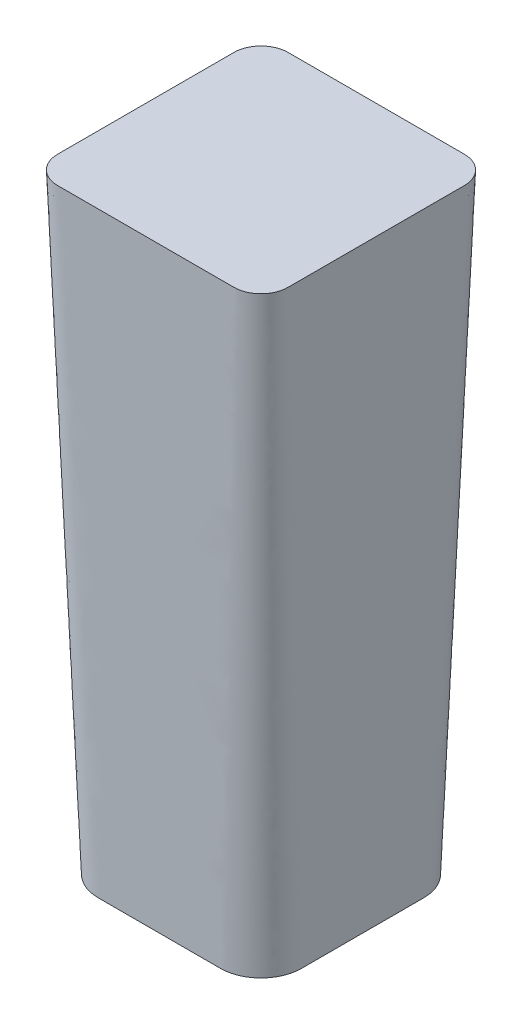
ISO-10303-21;
HEADER;
FILE_DESCRIPTION(('STEP AP214'),'2;1');
FILE_NAME('part.step','',(''),(''),'','','');
FILE_SCHEMA(('AUTOMOTIVE_DESIGN { 1 0 10303 214 1 1 1 1 }'));
ENDSEC;
DATA;
#1=APPLICATION_CONTEXT('core data for automotive mechanical design processes');
#2=APPLICATION_PROTOCOL_DEFINITION('international standard','automotive_design',2000,#1);
#3=PRODUCT_CONTEXT('',#1,'mechanical');
#4=PRODUCT('Part','Part','',(#3));
#5=PRODUCT_RELATED_PRODUCT_CATEGORY('part','',(#4));
#6=PRODUCT_DEFINITION_FORMATION('','',#4);
#7=PRODUCT_DEFINITION_CONTEXT('part definition',#1,'design');
#8=PRODUCT_DEFINITION('design','',#6,#7);
#9=PRODUCT_DEFINITION_SHAPE('','',#8);
#10=(LENGTH_UNIT() NAMED_UNIT(*) SI_UNIT(.MILLI.,.METRE.));
#11=(NAMED_UNIT(*) PLANE_ANGLE_UNIT() SI_UNIT($,.RADIAN.));
#12=(NAMED_UNIT(*) SI_UNIT($,.STERADIAN.) SOLID_ANGLE_UNIT());
#13=UNCERTAINTY_MEASURE_WITH_UNIT(LENGTH_MEASURE(1.E-05),#10,'distance_accuracy_value','');
#14=(GEOMETRIC_REPRESENTATION_CONTEXT(3) GLOBAL_UNCERTAINTY_ASSIGNED_CONTEXT((#13)) GLOBAL_UNIT_ASSIGNED_CONTEXT((#10,
#11,#12)) REPRESENTATION_CONTEXT('',''));
#15=CARTESIAN_POINT('',(0.,0.,0.));
#16=DIRECTION('',(0.,0.,1.));
#17=DIRECTION('',(1.,0.,0.));
#18=AXIS2_PLACEMENT_3D('',#15,#16,#17);
#19=CARTESIAN_POINT('',(-4.5,0.,-4.5));
#20=DIRECTION('',(0.,1.,0.));
#21=DIRECTION('',(0.,0.,1.));
#22=AXIS2_PLACEMENT_3D('',#19,#20,#21);
#23=PLANE('',#22);
#24=CARTESIAN_POINT('',(-4.5,0.,-4.5));
#25=DIRECTION('',(0.,1.,0.));
#26=DIRECTION('',(0.,0.,1.));
#27=AXIS2_PLACEMENT_3D('',#24,#25,#26);
#28=CIRCLE('',#27,3.);
#29=CARTESIAN_POINT('',(-4.49999999999998,0.,-7.5));
#30=VERTEX_POINT('',#29);
#31=CARTESIAN_POINT('',(-7.5,0.,-4.49999999999998));
#32=VERTEX_POINT('',#31);
#33=EDGE_CURVE('E306',#30,#32,#28,.T.);
#34=ORIENTED_EDGE('',*,*,#33,.F.);
#35=DIRECTION('',(1.,0.,0.));
#36=VECTOR('',#35,1.);
#37=CARTESIAN_POINT('',(-4.49999999999998,0.,-7.5));
#38=LINE('',#37,#36);
#39=CARTESIAN_POINT('',(4.49999999999998,0.,-7.5));
#40=VERTEX_POINT('',#39);
#41=EDGE_CURVE('E12',#30,#40,#38,.T.);
#42=ORIENTED_EDGE('',*,*,#41,.T.);
#43=CARTESIAN_POINT('',(4.5,0.,-4.5));
#44=DIRECTION('',(0.,1.,0.));
#45=DIRECTION('',(0.,0.,1.));
#46=AXIS2_PLACEMENT_3D('',#43,#44,#45);
#47=CIRCLE('',#46,3.);
#48=CARTESIAN_POINT('',(7.5,0.,-4.49999999999998));
#49=VERTEX_POINT('',#48);
#50=EDGE_CURVE('E242',#49,#40,#47,.T.);
#51=ORIENTED_EDGE('',*,*,#50,.F.);
#52=DIRECTION('',(0.,0.,1.));
#53=VECTOR('',#52,1.);
#54=CARTESIAN_POINT('',(7.5,0.,-4.49999999999998));
#55=LINE('',#54,#53);
#56=CARTESIAN_POINT('',(7.5,0.,4.49999999999998));
#57=VERTEX_POINT('',#56);
#58=EDGE_CURVE('E438',#49,#57,#55,.T.);
#59=ORIENTED_EDGE('',*,*,#58,.T.);
#60=CARTESIAN_POINT('',(4.5,0.,4.5));
#61=DIRECTION('',(0.,-1.,0.));
#62=DIRECTION('',(0.,0.,-1.));
#63=AXIS2_PLACEMENT_3D('',#60,#61,#62);
#64=CIRCLE('',#63,3.);
#65=CARTESIAN_POINT('',(4.49999999999998,0.,7.5));
#66=VERTEX_POINT('',#65);
#67=EDGE_CURVE('E448',#57,#66,#64,.T.);
#68=ORIENTED_EDGE('',*,*,#67,.T.);
#69=DIRECTION('',(1.,0.,0.));
#70=VECTOR('',#69,1.);
#71=CARTESIAN_POINT('',(-4.49999999999998,0.,7.5));
#72=LINE('',#71,#70);
#73=CARTESIAN_POINT('',(-4.49999999999998,0.,7.5));
#74=VERTEX_POINT('',#73);
#75=EDGE_CURVE('E462',#74,#66,#72,.T.);
#76=ORIENTED_EDGE('',*,*,#75,.F.);
#77=CARTESIAN_POINT('',(-4.5,0.,4.5));
#78=DIRECTION('',(0.,-1.,0.));
#79=DIRECTION('',(0.,0.,-1.));
#80=AXIS2_PLACEMENT_3D('',#77,#78,#79);
#81=CIRCLE('',#80,3.);
#82=CARTESIAN_POINT('',(-7.5,0.,4.49999999999998));
#83=VERTEX_POINT('',#82);
#84=EDGE_CURVE('E472',#74,#83,#81,.T.);
#85=ORIENTED_EDGE('',*,*,#84,.T.);
#86=DIRECTION('',(0.,0.,1.));
#87=VECTOR('',#86,1.);
#88=CARTESIAN_POINT('',(-7.5,0.,-4.49999999999998));
#89=LINE('',#88,#87);
#90=EDGE_CURVE('E485',#32,#83,#89,.T.);
#91=ORIENTED_EDGE('',*,*,#90,.F.);
#92=EDGE_LOOP('',(#34,#42,#51,#59,#68,#76,#85,#91));
#93=FACE_BOUND('',#92,.T.);
#94=ADVANCED_FACE('F232',(#93),#23,.F.);
#95=CARTESIAN_POINT('',(-6.5,45.,-6.5));
#96=DIRECTION('',(0.,1.,0.));
#97=DIRECTION('',(0.,0.,1.));
#98=AXIS2_PLACEMENT_3D('',#95,#96,#97);
#99=PLANE('',#98);
#100=CARTESIAN_POINT('',(-6.5,45.,-6.5));
#101=DIRECTION('',(0.,1.,0.));
#102=DIRECTION('',(0.,0.,1.));
#103=AXIS2_PLACEMENT_3D('',#100,#101,#102);
#104=CIRCLE('',#103,2.);
#105=CARTESIAN_POINT('',(-6.49999999999999,45.,-8.5));
#106=VERTEX_POINT('',#105);
#107=CARTESIAN_POINT('',(-8.5,45.,-6.49999999989903));
#108=VERTEX_POINT('',#107);
#109=EDGE_CURVE('E304',#106,#108,#104,.T.);
#110=ORIENTED_EDGE('',*,*,#109,.T.);
#111=DIRECTION('',(0.,0.,1.));
#112=VECTOR('',#111,1.);
#113=CARTESIAN_POINT('',(-8.5,45.,-6.49999999999999));
#114=LINE('',#113,#112);
#115=CARTESIAN_POINT('',(-8.50000000000001,45.,6.49999999999061));
#116=VERTEX_POINT('',#115);
#117=EDGE_CURVE('E373',#108,#116,#114,.T.);
#118=ORIENTED_EDGE('',*,*,#117,.T.);
#119=CARTESIAN_POINT('',(-6.5,45.,6.5));
#120=DIRECTION('',(0.,-1.,0.));
#121=DIRECTION('',(0.,0.,-1.));
#122=AXIS2_PLACEMENT_3D('',#119,#120,#121);
#123=CIRCLE('',#122,2.);
#124=CARTESIAN_POINT('',(-6.49999999989855,45.,8.5));
#125=VERTEX_POINT('',#124);
#126=EDGE_CURVE('E379',#125,#116,#123,.T.);
#127=ORIENTED_EDGE('',*,*,#126,.F.);
#128=DIRECTION('',(1.,0.,0.));
#129=VECTOR('',#128,1.);
#130=CARTESIAN_POINT('',(-6.49999999999999,45.,8.5));
#131=LINE('',#130,#129);
#132=CARTESIAN_POINT('',(6.49999999999062,45.,8.50000000000001));
#133=VERTEX_POINT('',#132);
#134=EDGE_CURVE('E382',#125,#133,#131,.T.);
#135=ORIENTED_EDGE('',*,*,#134,.T.);
#136=CARTESIAN_POINT('',(6.5,45.,6.5));
#137=DIRECTION('',(0.,1.,0.));
#138=DIRECTION('',(0.,0.,1.));
#139=AXIS2_PLACEMENT_3D('',#136,#137,#138);
#140=CIRCLE('',#139,2.);
#141=CARTESIAN_POINT('',(8.5,45.,6.49999999989878));
#142=VERTEX_POINT('',#141);
#143=EDGE_CURVE('E629',#133,#142,#140,.T.);
#144=ORIENTED_EDGE('',*,*,#143,.T.);
#145=DIRECTION('',(0.,0.,1.));
#146=VECTOR('',#145,1.);
#147=CARTESIAN_POINT('',(8.5,45.,-6.49999999999999));
#148=LINE('',#147,#146);
#149=CARTESIAN_POINT('',(8.5,45.,-6.49999999999061));
#150=VERTEX_POINT('',#149);
#151=EDGE_CURVE('E314',#150,#142,#148,.T.);
#152=ORIENTED_EDGE('',*,*,#151,.F.);
#153=CARTESIAN_POINT('',(6.5,45.,-6.5));
#154=DIRECTION('',(0.,1.,0.));
#155=DIRECTION('',(0.,0.,1.));
#156=AXIS2_PLACEMENT_3D('',#153,#154,#155);
#157=CIRCLE('',#156,2.);
#158=CARTESIAN_POINT('',(6.49999999999999,45.,-8.5));
#159=VERTEX_POINT('',#158);
#160=EDGE_CURVE('E298',#150,#159,#157,.T.);
#161=ORIENTED_EDGE('',*,*,#160,.T.);
#162=DIRECTION('',(1.,0.,0.));
#163=VECTOR('',#162,1.);
#164=CARTESIAN_POINT('',(-6.49999999999999,45.,-8.5));
#165=LINE('',#164,#163);
#166=EDGE_CURVE('E297',#106,#159,#165,.T.);
#167=ORIENTED_EDGE('',*,*,#166,.F.);
#168=EDGE_LOOP('',(#110,#118,#127,#135,#144,#152,#161,#167));
#169=FACE_BOUND('',#168,.T.);
#170=ADVANCED_FACE('F315',(#169),#99,.T.);
#171=CARTESIAN_POINT('',(-8.5,45.,-6.49999999900533));
#172=CARTESIAN_POINT('',(-7.5,0.,-4.49999999915501));
#173=CARTESIAN_POINT('',(-8.5,45.,-6.68101666314579));
#174=CARTESIAN_POINT('',(-7.5,0.,-4.65377484429544));
#175=CARTESIAN_POINT('',(-8.45546918815078,45.,-6.97896338001065));
#176=CARTESIAN_POINT('',(-7.47658017467527,0.,-4.98118495389371));
#177=CARTESIAN_POINT('',(-8.32489437031456,45.,-7.34666056267722));
#178=CARTESIAN_POINT('',(-7.33991561046586,0.,-5.52664169747813));
#179=CARTESIAN_POINT('',(-8.14404338130673,45.0000000000001,-7.65617542072074));
#180=CARTESIAN_POINT('',(-7.06661445087696,0.,-6.1002824564767));
#181=CARTESIAN_POINT('',(-7.9213235322031,44.9999999999999,-7.92132353220308));
#182=CARTESIAN_POINT('',(-6.64037493163232,0.,-6.64037493163233));
#183=CARTESIAN_POINT('',(-7.65617542072072,45.0000000000001,-8.14404338130675));
#184=CARTESIAN_POINT('',(-6.10028245647673,0.,-7.06661445087695));
#185=CARTESIAN_POINT('',(-7.34666056267723,45.,-8.32489437031455));
#186=CARTESIAN_POINT('',(-5.52664169747811,0.,-7.33991561046588));
#187=CARTESIAN_POINT('',(-6.97896338001064,45.,-8.45546918815078));
#188=CARTESIAN_POINT('',(-4.98118495389372,0.,-7.47658017467526));
#189=CARTESIAN_POINT('',(-6.68101666314579,45.,-8.5));
#190=CARTESIAN_POINT('',(-4.65377484429544,0.,-7.5));
#191=CARTESIAN_POINT('',(-5.51690060751472,45.,-8.5));
#192=CARTESIAN_POINT('',(-3.66485060889328,0.,-7.5));
#193=CARTESIAN_POINT('',(-3.42313586271209,45.,-8.5));
#194=CARTESIAN_POINT('',(-2.14146824762083,0.,-7.5));
#195=CARTESIAN_POINT('',(0.,45.,-8.5));
#196=CARTESIAN_POINT('',(0.,0.,-7.5));
#197=CARTESIAN_POINT('',(3.42313586271209,45.,-8.5));
#198=CARTESIAN_POINT('',(2.14146824762083,0.,-7.5));
#199=CARTESIAN_POINT('',(5.51690060751472,45.,-8.5));
#200=CARTESIAN_POINT('',(3.66485060889328,0.,-7.5));
#201=CARTESIAN_POINT('',(6.68101666314579,45.,-8.5));
#202=CARTESIAN_POINT('',(4.65377484429544,0.,-7.5));
#203=CARTESIAN_POINT('',(6.97896338001065,45.,-8.45546918815077));
#204=CARTESIAN_POINT('',(4.9811849538937,0.,-7.47658017467526));
#205=CARTESIAN_POINT('',(7.34666056267722,45.,-8.32489437031456));
#206=CARTESIAN_POINT('',(5.52664169747813,0.,-7.33991561046588));
#207=CARTESIAN_POINT('',(7.65617542072072,45.,-8.14404338130673));
#208=CARTESIAN_POINT('',(6.10028245647671,0.,-7.06661445087695));
#209=CARTESIAN_POINT('',(7.9213235322031,45.,-7.92132353220309));
#210=CARTESIAN_POINT('',(6.64037493163233,0.,-6.64037493163233));
#211=CARTESIAN_POINT('',(8.14404338130674,45.0000000000001,-7.65617542072073));
#212=CARTESIAN_POINT('',(7.06661445087695,0.,-6.10028245647672));
#213=CARTESIAN_POINT('',(8.32489437031455,44.9999999999999,-7.34666056267722));
#214=CARTESIAN_POINT('',(7.33991561046588,0.,-5.52664169747812));
#215=CARTESIAN_POINT('',(8.45546918815078,45.0000000000001,-6.97896338001065));
#216=CARTESIAN_POINT('',(7.47658017467526,0.,-4.98118495389371));
#217=CARTESIAN_POINT('',(8.5,45.,-6.68101666314579));
#218=CARTESIAN_POINT('',(7.5,0.,-4.65377484429544));
#219=CARTESIAN_POINT('',(8.5,45.,-5.51690060751472));
#220=CARTESIAN_POINT('',(7.5,0.,-3.66485060889328));
#221=CARTESIAN_POINT('',(8.50000000000002,45.,-3.4231358627121));
#222=CARTESIAN_POINT('',(7.5,0.,-2.14146824762083));
#223=CARTESIAN_POINT('',(8.49999999999998,45.,0.));
#224=CARTESIAN_POINT('',(7.5,0.,0.));
#225=CARTESIAN_POINT('',(8.50000000000001,45.,3.42313586271208));
#226=CARTESIAN_POINT('',(7.5,0.,2.14146824762083));
#227=CARTESIAN_POINT('',(8.5,45.,5.51690060751472));
#228=CARTESIAN_POINT('',(7.5,0.,3.66485060889328));
#229=CARTESIAN_POINT('',(8.5,45.,6.68101666314579));
#230=CARTESIAN_POINT('',(7.5,0.,4.65377484429544));
#231=CARTESIAN_POINT('',(8.45546918815077,45.0000000000001,6.97896338001063));
#232=CARTESIAN_POINT('',(7.47658017467526,0.,4.98118495389371));
#233=CARTESIAN_POINT('',(8.32489437031457,44.9999999999999,7.34666056267724));
#234=CARTESIAN_POINT('',(7.33991561046587,0.,5.52664169747811));
#235=CARTESIAN_POINT('',(8.14404338130672,45.,7.65617542072071));
#236=CARTESIAN_POINT('',(7.06661445087695,0.,6.10028245647671));
#237=CARTESIAN_POINT('',(7.92132353220311,45.,7.92132353220311));
#238=CARTESIAN_POINT('',(6.64037493163233,0.,6.64037493163232));
#239=CARTESIAN_POINT('',(7.65617542072072,45.,8.14404338130672));
#240=CARTESIAN_POINT('',(6.10028245647671,0.,7.06661445087695));
#241=CARTESIAN_POINT('',(7.34666056267723,45.,8.32489437031456));
#242=CARTESIAN_POINT('',(5.52664169747812,0.,7.33991561046588));
#243=CARTESIAN_POINT('',(6.97896338001064,45.,8.45546918815077));
#244=CARTESIAN_POINT('',(4.98118495389371,0.,7.47658017467525));
#245=CARTESIAN_POINT('',(6.68101666314579,45.,8.5));
#246=CARTESIAN_POINT('',(4.65377484429544,0.,7.5));
#247=CARTESIAN_POINT('',(5.51690060751472,45.,8.5));
#248=CARTESIAN_POINT('',(3.66485060889328,0.,7.5));
#249=CARTESIAN_POINT('',(3.42313586271209,45.,8.5));
#250=CARTESIAN_POINT('',(2.14146824762083,0.,7.5));
#251=CARTESIAN_POINT('',(0.,45.,8.5));
#252=CARTESIAN_POINT('',(0.,0.,7.5));
#253=CARTESIAN_POINT('',(-3.42313586271209,45.,8.50000000000001));
#254=CARTESIAN_POINT('',(-2.14146824762083,0.,7.5));
#255=CARTESIAN_POINT('',(-5.51690060751472,45.,8.5));
#256=CARTESIAN_POINT('',(-3.66485060889328,0.,7.5));
#257=CARTESIAN_POINT('',(-6.68101666314579,45.,8.5));
#258=CARTESIAN_POINT('',(-4.65377484429544,0.,7.5));
#259=CARTESIAN_POINT('',(-6.97896338001065,45.,8.45546918815079));
#260=CARTESIAN_POINT('',(-4.98118495389372,0.,7.47658017467524));
#261=CARTESIAN_POINT('',(-7.34666056267722,45.,8.32489437031454));
#262=CARTESIAN_POINT('',(-5.52664169747811,0.,7.33991561046589));
#263=CARTESIAN_POINT('',(-7.65617542072073,45.0000000000001,8.14404338130675));
#264=CARTESIAN_POINT('',(-6.10028245647674,0.,7.06661445087694));
#265=CARTESIAN_POINT('',(-7.9213235322031,44.9999999999999,7.92132353220307));
#266=CARTESIAN_POINT('',(-6.64037493163231,0.,6.64037493163233));
#267=CARTESIAN_POINT('',(-8.14404338130674,45.0000000000001,7.65617542072075));
#268=CARTESIAN_POINT('',(-7.06661445087698,0.,6.10028245647672));
#269=CARTESIAN_POINT('',(-8.32489437031455,44.9999999999999,7.34666056267721));
#270=CARTESIAN_POINT('',(-7.33991561046585,0.,5.52664169747812));
#271=CARTESIAN_POINT('',(-8.45546918815078,45.0000000000001,6.97896338001066));
#272=CARTESIAN_POINT('',(-7.47658017467526,0.,4.98118495389371));
#273=CARTESIAN_POINT('',(-8.5,45.,6.68101666314579));
#274=CARTESIAN_POINT('',(-7.5,0.,4.65377484429544));
#275=CARTESIAN_POINT('',(-8.5,45.,5.51690060751472));
#276=CARTESIAN_POINT('',(-7.5,0.,3.66485060889328));
#277=CARTESIAN_POINT('',(-8.5,45.,3.42313586271209));
#278=CARTESIAN_POINT('',(-7.5,0.,2.14146824762083));
#279=CARTESIAN_POINT('',(-8.5,45.,0.));
#280=CARTESIAN_POINT('',(-7.49999999999999,0.,0.));
#281=CARTESIAN_POINT('',(-8.5,45.,-3.42313586271209));
#282=CARTESIAN_POINT('',(-7.5,0.,-2.14146824762083));
#283=CARTESIAN_POINT('',(-8.5,45.,-5.51690060751472));
#284=CARTESIAN_POINT('',(-7.5,0.,-3.66485060889328));
#285=CARTESIAN_POINT('',(-8.5,45.,-6.49999999900533));
#286=CARTESIAN_POINT('',(-7.5,0.,-4.49999999915501));
#287=B_SPLINE_SURFACE_WITH_KNOTS('',3,1,((#171,#172),(#173,#174),(#175,#176),(#177,#178),(#179,
#180),(#181,#182),(#183,#184),(#185,#186),(#187,#188),(#189,#190),(#191,#192),(#193,#194),(#195,
#196),(#197,#198),(#199,#200),(#201,#202),(#203,#204),(#205,#206),(#207,#208),(#209,#210),(#211,
#212),(#213,#214),(#215,#216),(#217,#218),(#219,#220),(#221,#222),(#223,#224),(#225,#226),(#227,
#228),(#229,#230),(#231,#232),(#233,#234),(#235,#236),(#237,#238),(#239,#240),(#241,#242),(#243,
#244),(#245,#246),(#247,#248),(#249,#250),(#251,#252),(#253,#254),(#255,#256),(#257,#258),(#259,
#260),(#261,#262),(#263,#264),(#265,#266),(#267,#268),(#269,#270),(#271,#272),(#273,#274),(#275,
#276),(#277,#278),(#279,#280),(#281,#282),(#283,#284),(#285,#286)),.UNSPECIFIED.,.T.,.F.,.F.,(4,
1,1,1,1,1,1,1,2,1,1,1,2,1,1,1,1,1,1,1,2,1,1,1,2,1,1,1,1,1,1,1,2,1,1,1,2,1,1,1,1,1,1,1,2,1,1,1,
4),(2,2),(0.,0.00841072508495708,0.0168214501699142,0.0252321752548712,0.0336429003398283,
0.0420536254247854,0.0504643505097425,0.0588750755946995,0.0672858006796566,0.112964350509742,
0.158642900339828,0.204321450169914,0.25,0.258410725084957,0.266821450169914,0.275232175254871,
0.283642900339828,0.292053625424785,0.300464350509743,0.3088750755947,0.317285800679657,
0.362964350509742,0.408642900339828,0.454321450169914,0.5,0.508410725084957,0.516821450169914,
0.525232175254871,0.533642900339828,0.542053625424785,0.550464350509743,0.5588750755947,
0.567285800679657,0.612964350509743,0.658642900339828,0.704321450169914,0.75,0.758410725084957,
0.766821450169914,0.775232175254871,0.783642900339828,0.792053625424785,0.800464350509742,
0.8088750755947,0.817285800679657,0.862964350509742,0.908642900339828,0.954321450169914,1.),(0.,
1.),.UNSPECIFIED.);
#288=CARTESIAN_POINT('',(0.,45.,-8.5));
#289=CARTESIAN_POINT('',(0.,0.,-7.5));
#290=CARTESIAN_POINT('',(1.1410452875707,45.,-8.5));
#291=CARTESIAN_POINT('',(0.713822749206944,0.,-7.5));
#292=CARTESIAN_POINT('',(3.42313586271209,45.,-8.5));
#293=CARTESIAN_POINT('',(2.14146824762083,0.,-7.5));
#294=CARTESIAN_POINT('',(5.51690060751472,45.,-8.5));
#295=CARTESIAN_POINT('',(3.66485060889328,0.,-7.5));
#296=CARTESIAN_POINT('',(6.68101666314579,45.,-8.5));
#297=CARTESIAN_POINT('',(4.65377484429544,0.,-7.5));
#298=CARTESIAN_POINT('',(6.97896338001065,45.,-8.45546918815077));
#299=CARTESIAN_POINT('',(4.9811849538937,0.,-7.47658017467526));
#300=CARTESIAN_POINT('',(7.34666056267722,45.,-8.32489437031456));
#301=CARTESIAN_POINT('',(5.52664169747813,0.,-7.33991561046588));
#302=CARTESIAN_POINT('',(7.65617542072072,45.,-8.14404338130673));
#303=CARTESIAN_POINT('',(6.10028245647671,0.,-7.06661445087695));
#304=CARTESIAN_POINT('',(7.9213235322031,45.,-7.92132353220309));
#305=CARTESIAN_POINT('',(6.64037493163233,0.,-6.64037493163233));
#306=CARTESIAN_POINT('',(8.14404338130674,45.0000000000001,-7.65617542072073));
#307=CARTESIAN_POINT('',(7.06661445087695,0.,-6.10028245647672));
#308=CARTESIAN_POINT('',(8.32489437031455,44.9999999999999,-7.34666056267722));
#309=CARTESIAN_POINT('',(7.33991561046588,0.,-5.52664169747812));
#310=CARTESIAN_POINT('',(8.45546918815078,45.0000000000001,-6.97896338001065));
#311=CARTESIAN_POINT('',(7.47658017467526,0.,-4.98118495389371));
#312=CARTESIAN_POINT('',(8.5,45.,-6.68101666314579));
#313=CARTESIAN_POINT('',(7.5,0.,-4.65377484429544));
#314=CARTESIAN_POINT('',(8.5,45.,-5.51690060751472));
#315=CARTESIAN_POINT('',(7.5,0.,-3.66485060889328));
#316=CARTESIAN_POINT('',(8.50000000000002,45.,-3.4231358627121));
#317=CARTESIAN_POINT('',(7.5,0.,-2.14146824762083));
#318=CARTESIAN_POINT('',(8.49999999999998,45.,0.));
#319=CARTESIAN_POINT('',(7.5,0.,0.));
#320=CARTESIAN_POINT('',(8.50000000000001,45.,3.42313586271208));
#321=CARTESIAN_POINT('',(7.5,0.,2.14146824762083));
#322=CARTESIAN_POINT('',(8.5,45.,5.51690060751472));
#323=CARTESIAN_POINT('',(7.5,0.,3.66485060889328));
#324=CARTESIAN_POINT('',(8.5,45.,6.68101666314579));
#325=CARTESIAN_POINT('',(7.5,0.,4.65377484429544));
#326=CARTESIAN_POINT('',(8.45546918815077,45.0000000000001,6.97896338001063));
#327=CARTESIAN_POINT('',(7.47658017467526,0.,4.98118495389371));
#328=CARTESIAN_POINT('',(8.32489437031457,44.9999999999999,7.34666056267724));
#329=CARTESIAN_POINT('',(7.33991561046587,0.,5.52664169747811));
#330=CARTESIAN_POINT('',(8.14404338130672,45.,7.65617542072071));
#331=CARTESIAN_POINT('',(7.06661445087695,0.,6.10028245647671));
#332=CARTESIAN_POINT('',(7.92132353220311,45.,7.92132353220311));
#333=CARTESIAN_POINT('',(6.64037493163233,0.,6.64037493163232));
#334=CARTESIAN_POINT('',(7.65617542072072,45.,8.14404338130672));
#335=CARTESIAN_POINT('',(6.10028245647671,0.,7.06661445087695));
#336=CARTESIAN_POINT('',(7.34666056267723,45.,8.32489437031456));
#337=CARTESIAN_POINT('',(5.52664169747812,0.,7.33991561046588));
#338=CARTESIAN_POINT('',(6.97896338001064,45.,8.45546918815077));
#339=CARTESIAN_POINT('',(4.98118495389371,0.,7.47658017467525));
#340=CARTESIAN_POINT('',(6.68101666314579,45.,8.5));
#341=CARTESIAN_POINT('',(4.65377484429544,0.,7.5));
#342=CARTESIAN_POINT('',(5.51690060751472,45.,8.5));
#343=CARTESIAN_POINT('',(3.66485060889328,0.,7.5));
#344=CARTESIAN_POINT('',(3.42313586271209,45.,8.5));
#345=CARTESIAN_POINT('',(2.14146824762083,0.,7.5));
#346=CARTESIAN_POINT('',(0.,45.,8.5));
#347=CARTESIAN_POINT('',(0.,0.,7.5));
#348=CARTESIAN_POINT('',(-3.42313586271209,45.,8.50000000000001));
#349=CARTESIAN_POINT('',(-2.14146824762083,0.,7.5));
#350=CARTESIAN_POINT('',(-5.51690060751472,45.,8.5));
#351=CARTESIAN_POINT('',(-3.66485060889328,0.,7.5));
#352=CARTESIAN_POINT('',(-6.68101666314579,45.,8.5));
#353=CARTESIAN_POINT('',(-4.65377484429544,0.,7.5));
#354=CARTESIAN_POINT('',(-6.97896338001065,45.,8.45546918815079));
#355=CARTESIAN_POINT('',(-4.98118495389372,0.,7.47658017467524));
#356=CARTESIAN_POINT('',(-7.34666056267722,45.,8.32489437031454));
#357=CARTESIAN_POINT('',(-5.52664169747811,0.,7.33991561046589));
#358=CARTESIAN_POINT('',(-7.65617542072073,45.0000000000001,8.14404338130675));
#359=CARTESIAN_POINT('',(-6.10028245647674,0.,7.06661445087694));
#360=CARTESIAN_POINT('',(-7.9213235322031,44.9999999999999,7.92132353220307));
#361=CARTESIAN_POINT('',(-6.64037493163231,0.,6.64037493163233));
#362=CARTESIAN_POINT('',(-8.14404338130674,45.0000000000001,7.65617542072075));
#363=CARTESIAN_POINT('',(-7.06661445087698,0.,6.10028245647672));
#364=CARTESIAN_POINT('',(-8.32489437031455,44.9999999999999,7.34666056267721));
#365=CARTESIAN_POINT('',(-7.33991561046585,0.,5.52664169747812));
#366=CARTESIAN_POINT('',(-8.45546918815078,45.0000000000001,6.97896338001066));
#367=CARTESIAN_POINT('',(-7.47658017467526,0.,4.98118495389371));
#368=CARTESIAN_POINT('',(-8.5,45.,6.68101666314579));
#369=CARTESIAN_POINT('',(-7.5,0.,4.65377484429544));
#370=CARTESIAN_POINT('',(-8.5,45.,5.51690060751472));
#371=CARTESIAN_POINT('',(-7.5,0.,3.66485060889328));
#372=CARTESIAN_POINT('',(-8.5,45.,3.42313586271209));
#373=CARTESIAN_POINT('',(-7.5,0.,2.14146824762083));
#374=CARTESIAN_POINT('',(-8.5,45.,0.));
#375=CARTESIAN_POINT('',(-7.49999999999999,0.,0.));
#376=CARTESIAN_POINT('',(-8.5,45.,-3.42313586271209));
#377=CARTESIAN_POINT('',(-7.5,0.,-2.14146824762083));
#378=CARTESIAN_POINT('',(-8.5,45.,-5.51690060751472));
#379=CARTESIAN_POINT('',(-7.5,0.,-3.66485060889328));
#380=CARTESIAN_POINT('',(-8.5,45.,-6.68101666314579));
#381=CARTESIAN_POINT('',(-7.5,0.,-4.65377484429544));
#382=CARTESIAN_POINT('',(-8.45546918815078,45.,-6.97896338001065));
#383=CARTESIAN_POINT('',(-7.47658017467527,0.,-4.98118495389371));
#384=CARTESIAN_POINT('',(-8.32489437031456,45.,-7.34666056267722));
#385=CARTESIAN_POINT('',(-7.33991561046586,0.,-5.52664169747813));
#386=CARTESIAN_POINT('',(-8.14404338130673,45.0000000000001,-7.65617542072074));
#387=CARTESIAN_POINT('',(-7.06661445087696,0.,-6.1002824564767));
#388=CARTESIAN_POINT('',(-7.9213235322031,44.9999999999999,-7.92132353220308));
#389=CARTESIAN_POINT('',(-6.64037493163232,0.,-6.64037493163233));
#390=CARTESIAN_POINT('',(-7.65617542072072,45.0000000000001,-8.14404338130675));
#391=CARTESIAN_POINT('',(-6.10028245647673,0.,-7.06661445087695));
#392=CARTESIAN_POINT('',(-7.34666056267723,45.,-8.32489437031455));
#393=CARTESIAN_POINT('',(-5.52664169747811,0.,-7.33991561046588));
#394=CARTESIAN_POINT('',(-6.97896338001064,45.,-8.45546918815078));
#395=CARTESIAN_POINT('',(-4.98118495389372,0.,-7.47658017467526));
#396=CARTESIAN_POINT('',(-6.68101666314579,45.,-8.5));
#397=CARTESIAN_POINT('',(-4.65377484429544,0.,-7.5));
#398=CARTESIAN_POINT('',(-5.51690060751472,45.,-8.5));
#399=CARTESIAN_POINT('',(-3.66485060889328,0.,-7.5));
#400=CARTESIAN_POINT('',(-3.42313586271209,45.,-8.5));
#401=CARTESIAN_POINT('',(-2.14146824762083,0.,-7.5));
#402=CARTESIAN_POINT('',(-1.14104528757069,45.,-8.5));
#403=CARTESIAN_POINT('',(-0.713822749206942,0.,-7.5));
#404=CARTESIAN_POINT('',(0.,45.,-8.5));
#405=CARTESIAN_POINT('',(0.,0.,-7.5));
#406=B_SPLINE_SURFACE_WITH_KNOTS('',3,1,((#288,#289),(#290,#291),(#292,#293),(#294,#295),(#296,
#297),(#298,#299),(#300,#301),(#302,#303),(#304,#305),(#306,#307),(#308,#309),(#310,#311),(#312,
#313),(#314,#315),(#316,#317),(#318,#319),(#320,#321),(#322,#323),(#324,#325),(#326,#327),(#328,
#329),(#330,#331),(#332,#333),(#334,#335),(#336,#337),(#338,#339),(#340,#341),(#342,#343),(#344,
#345),(#346,#347),(#348,#349),(#350,#351),(#352,#353),(#354,#355),(#356,#357),(#358,#359),(#360,
#361),(#362,#363),(#364,#365),(#366,#367),(#368,#369),(#370,#371),(#372,#373),(#374,#375),(#376,
#377),(#378,#379),(#380,#381),(#382,#383),(#384,#385),(#386,#387),(#388,#389),(#390,#391),(#392,
#393),(#394,#395),(#396,#397),(#398,#399),(#400,#401),(#402,#403),(#404,#405)),.UNSPECIFIED.,
.T.,.F.,.F.,(4,1,2,1,1,1,1,1,1,1,2,1,1,1,2,1,1,1,1,1,1,1,2,1,1,1,2,1,1,1,1,1,1,1,2,1,1,1,2,1,1,
1,1,1,1,1,2,1,4),(2,2),(0.158642900339828,0.204321450169914,0.25,0.258410725084957,
0.266821450169914,0.275232175254871,0.283642900339828,0.292053625424785,0.300464350509743,
0.3088750755947,0.317285800679657,0.362964350509742,0.408642900339828,0.454321450169914,0.5,
0.508410725084957,0.516821450169914,0.525232175254871,0.533642900339828,0.542053625424785,
0.550464350509743,0.5588750755947,0.567285800679657,0.612964350509743,0.658642900339828,
0.704321450169914,0.75,0.758410725084957,0.766821450169914,0.775232175254871,0.783642900339828,
0.792053625424785,0.800464350509742,0.8088750755947,0.817285800679657,0.862964350509742,
0.908642900339828,0.954321450169914,1.,1.00841072508496,1.01682145016991,1.02523217525487,
1.03364290033983,1.04205362542479,1.05046435050974,1.0588750755947,1.06728580067966,
1.11296435050974,1.15864290033983),(0.,1.),.UNSPECIFIED.);
#407=ORIENTED_EDGE('',*,*,#166,.T.);
#408=ORIENTED_EDGE('',*,*,#160,.F.);
#409=ORIENTED_EDGE('',*,*,#151,.T.);
#410=ORIENTED_EDGE('',*,*,#143,.F.);
#411=ORIENTED_EDGE('',*,*,#134,.F.);
#412=ORIENTED_EDGE('',*,*,#126,.T.);
#413=ORIENTED_EDGE('',*,*,#117,.F.);
#414=ORIENTED_EDGE('',*,*,#109,.F.);
#415=EDGE_LOOP('',(#407,#408,#409,#410,#411,#412,#413,#414));
#416=FACE_BOUND('',#415,.T.);
#417=ORIENTED_EDGE('',*,*,#33,.T.);
#418=ORIENTED_EDGE('',*,*,#90,.T.);
#419=ORIENTED_EDGE('',*,*,#84,.F.);
#420=ORIENTED_EDGE('',*,*,#75,.T.);
#421=ORIENTED_EDGE('',*,*,#67,.F.);
#422=ORIENTED_EDGE('',*,*,#58,.F.);
#423=ORIENTED_EDGE('',*,*,#50,.T.);
#424=ORIENTED_EDGE('',*,*,#41,.F.);
#425=EDGE_LOOP('',(#417,#418,#419,#420,#421,#422,#423,#424));
#426=FACE_BOUND('',#425,.T.);
#427=ADVANCED_FACE('F296',(#416,#426),#406,.T.);
#428=CLOSED_SHELL('',(#94,#170,#427));
#429=MANIFOLD_SOLID_BREP('B2',#428);
#430=ADVANCED_BREP_SHAPE_REPRESENTATION('',(#18,#429),#14);
#431=SHAPE_DEFINITION_REPRESENTATION(#9,#430);
ENDSEC;
END-ISO-10303-21;
